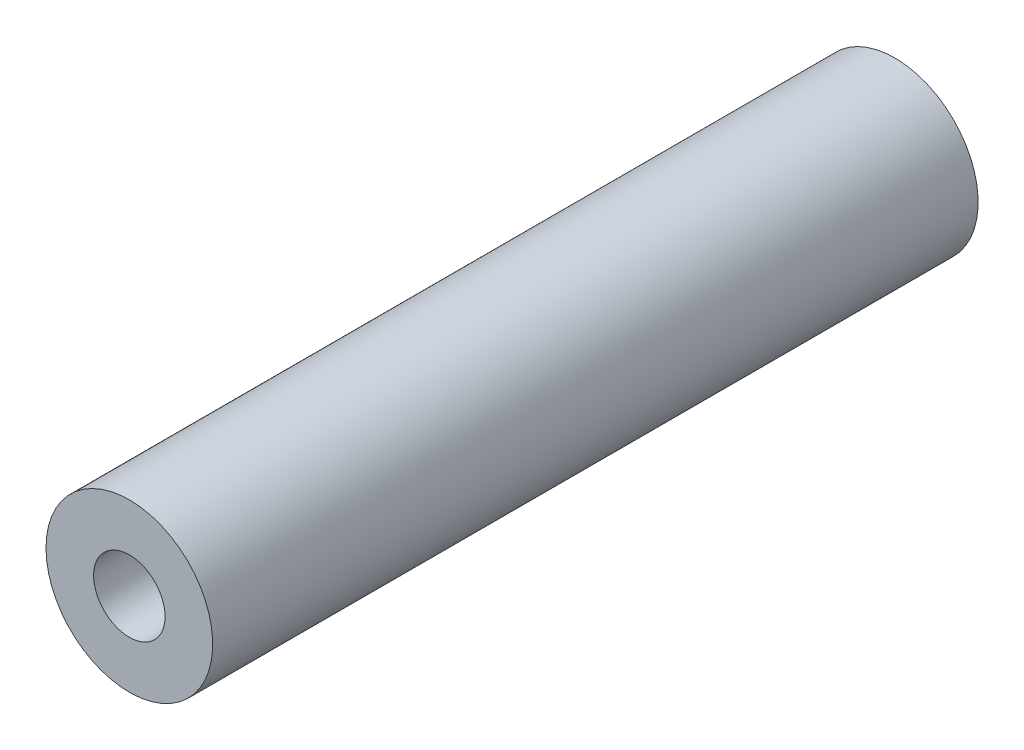
ISO-10303-21;
HEADER;
FILE_DESCRIPTION(('STEP AP214'),'2;1');
FILE_NAME('part.step','',(''),(''),'','','');
FILE_SCHEMA(('AUTOMOTIVE_DESIGN { 1 0 10303 214 1 1 1 1 }'));
ENDSEC;
DATA;
#1=APPLICATION_CONTEXT('core data for automotive mechanical design processes');
#2=APPLICATION_PROTOCOL_DEFINITION('international standard','automotive_design',2000,#1);
#3=PRODUCT_CONTEXT('',#1,'mechanical');
#4=PRODUCT('Part','Part','',(#3));
#5=PRODUCT_RELATED_PRODUCT_CATEGORY('part','',(#4));
#6=PRODUCT_DEFINITION_FORMATION('','',#4);
#7=PRODUCT_DEFINITION_CONTEXT('part definition',#1,'design');
#8=PRODUCT_DEFINITION('design','',#6,#7);
#9=PRODUCT_DEFINITION_SHAPE('','',#8);
#10=(LENGTH_UNIT() NAMED_UNIT(*) SI_UNIT(.MILLI.,.METRE.));
#11=(NAMED_UNIT(*) PLANE_ANGLE_UNIT() SI_UNIT($,.RADIAN.));
#12=(NAMED_UNIT(*) SI_UNIT($,.STERADIAN.) SOLID_ANGLE_UNIT());
#13=UNCERTAINTY_MEASURE_WITH_UNIT(LENGTH_MEASURE(1.E-05),#10,'distance_accuracy_value','');
#14=(GEOMETRIC_REPRESENTATION_CONTEXT(3) GLOBAL_UNCERTAINTY_ASSIGNED_CONTEXT((#13)) GLOBAL_UNIT_ASSIGNED_CONTEXT((#10,
#11,#12)) REPRESENTATION_CONTEXT('',''));
#15=CARTESIAN_POINT('',(0.,0.,0.));
#16=DIRECTION('',(0.,0.,1.));
#17=DIRECTION('',(1.,0.,0.));
#18=AXIS2_PLACEMENT_3D('',#15,#16,#17);
#19=CARTESIAN_POINT('',(0.,0.,45.));
#20=DIRECTION('',(0.,0.,-1.));
#21=DIRECTION('',(-1.,0.,0.));
#22=AXIS2_PLACEMENT_3D('',#19,#20,#21);
#23=CYLINDRICAL_SURFACE('',#22,4.9);
#24=CARTESIAN_POINT('',(0.,0.,45.));
#25=DIRECTION('',(0.,0.,1.));
#26=DIRECTION('',(1.,0.,0.));
#27=AXIS2_PLACEMENT_3D('',#24,#25,#26);
#28=CIRCLE('',#27,4.9);
#29=CARTESIAN_POINT('',(-4.9,0.,45.));
#30=VERTEX_POINT('',#29);
#31=EDGE_CURVE('E11',#30,#30,#28,.T.);
#32=CARTESIAN_POINT('',(0.,0.,0.));
#33=DIRECTION('',(0.,0.,1.));
#34=DIRECTION('',(1.,0.,0.));
#35=AXIS2_PLACEMENT_3D('',#32,#33,#34);
#36=CIRCLE('',#35,4.9);
#37=CARTESIAN_POINT('',(-4.9,0.,0.));
#38=VERTEX_POINT('',#37);
#39=EDGE_CURVE('E48',#38,#38,#36,.T.);
#40=CARTESIAN_POINT('',(-4.9,0.,45.));
#41=CARTESIAN_POINT('',(-4.9,0.,44.53125));
#42=CARTESIAN_POINT('',(-4.9,0.,44.0625));
#43=CARTESIAN_POINT('',(-4.9,0.,43.125));
#44=CARTESIAN_POINT('',(-4.9,0.,42.65625));
#45=CARTESIAN_POINT('',(-4.9,0.,41.71875));
#46=CARTESIAN_POINT('',(-4.9,0.,41.25));
#47=CARTESIAN_POINT('',(-4.9,0.,40.3125));
#48=CARTESIAN_POINT('',(-4.9,0.,39.84375));
#49=CARTESIAN_POINT('',(-4.9,0.,38.90625));
#50=CARTESIAN_POINT('',(-4.9,0.,38.4375));
#51=CARTESIAN_POINT('',(-4.9,0.,37.5));
#52=CARTESIAN_POINT('',(-4.9,0.,37.03125));
#53=CARTESIAN_POINT('',(-4.9,0.,36.09375));
#54=CARTESIAN_POINT('',(-4.9,0.,35.625));
#55=CARTESIAN_POINT('',(-4.9,0.,34.6875));
#56=CARTESIAN_POINT('',(-4.9,0.,34.21875));
#57=CARTESIAN_POINT('',(-4.9,0.,33.28125));
#58=CARTESIAN_POINT('',(-4.9,0.,32.8125));
#59=CARTESIAN_POINT('',(-4.9,0.,31.875));
#60=CARTESIAN_POINT('',(-4.9,0.,31.40625));
#61=CARTESIAN_POINT('',(-4.9,0.,30.46875));
#62=CARTESIAN_POINT('',(-4.9,0.,30.));
#63=CARTESIAN_POINT('',(-4.9,0.,29.0625));
#64=CARTESIAN_POINT('',(-4.9,0.,28.59375));
#65=CARTESIAN_POINT('',(-4.9,0.,27.65625));
#66=CARTESIAN_POINT('',(-4.9,0.,27.1875));
#67=CARTESIAN_POINT('',(-4.9,0.,26.25));
#68=CARTESIAN_POINT('',(-4.9,0.,25.78125));
#69=CARTESIAN_POINT('',(-4.9,0.,24.84375));
#70=CARTESIAN_POINT('',(-4.9,0.,24.375));
#71=CARTESIAN_POINT('',(-4.9,0.,23.4375));
#72=CARTESIAN_POINT('',(-4.9,0.,22.96875));
#73=CARTESIAN_POINT('',(-4.9,0.,22.03125));
#74=CARTESIAN_POINT('',(-4.9,0.,21.5625));
#75=CARTESIAN_POINT('',(-4.9,0.,20.625));
#76=CARTESIAN_POINT('',(-4.9,0.,20.15625));
#77=CARTESIAN_POINT('',(-4.9,0.,19.21875));
#78=CARTESIAN_POINT('',(-4.9,0.,18.75));
#79=CARTESIAN_POINT('',(-4.9,0.,17.8125));
#80=CARTESIAN_POINT('',(-4.9,0.,17.34375));
#81=CARTESIAN_POINT('',(-4.9,0.,16.40625));
#82=CARTESIAN_POINT('',(-4.9,0.,15.9375));
#83=CARTESIAN_POINT('',(-4.9,0.,15.));
#84=CARTESIAN_POINT('',(-4.9,0.,14.53125));
#85=CARTESIAN_POINT('',(-4.9,0.,13.59375));
#86=CARTESIAN_POINT('',(-4.9,0.,13.125));
#87=CARTESIAN_POINT('',(-4.9,0.,12.1875));
#88=CARTESIAN_POINT('',(-4.9,0.,11.71875));
#89=CARTESIAN_POINT('',(-4.9,0.,10.78125));
#90=CARTESIAN_POINT('',(-4.9,0.,10.3125));
#91=CARTESIAN_POINT('',(-4.9,0.,9.37499999999999));
#92=CARTESIAN_POINT('',(-4.9,0.,8.90624999999999));
#93=CARTESIAN_POINT('',(-4.9,0.,7.96874999999999));
#94=CARTESIAN_POINT('',(-4.9,0.,7.5));
#95=CARTESIAN_POINT('',(-4.9,0.,6.56249999999999));
#96=CARTESIAN_POINT('',(-4.9,0.,6.09374999999999));
#97=CARTESIAN_POINT('',(-4.9,0.,5.15624999999999));
#98=CARTESIAN_POINT('',(-4.9,0.,4.68749999999999));
#99=CARTESIAN_POINT('',(-4.9,0.,3.74999999999999));
#100=CARTESIAN_POINT('',(-4.9,0.,3.28124999999999));
#101=CARTESIAN_POINT('',(-4.9,0.,2.34374999999999));
#102=CARTESIAN_POINT('',(-4.9,0.,1.87499999999999));
#103=CARTESIAN_POINT('',(-4.9,0.,0.937499999999992));
#104=CARTESIAN_POINT('',(-4.9,0.,0.468749999999993));
#105=CARTESIAN_POINT('',(-4.9,0.,0.));
#106=B_SPLINE_CURVE_WITH_KNOTS('',3,(#40,#41,#42,#43,#44,#45,#46,#47,#48,#49,#50,#51,#52,#53,
#54,#55,#56,#57,#58,#59,#60,#61,#62,#63,#64,#65,#66,#67,#68,#69,#70,#71,#72,#73,#74,#75,#76,#77,
#78,#79,#80,#81,#82,#83,#84,#85,#86,#87,#88,#89,#90,#91,#92,#93,#94,#95,#96,#97,#98,#99,#100,
#101,#102,#103,#104,#105),.UNSPECIFIED.,.F.,.F.,(4,2,2,2,2,2,2,2,2,2,2,2,2,2,2,2,2,2,2,2,2,2,2,
2,2,2,2,2,2,2,2,2,4),(0.,1.40625,2.8125,4.21874999999999,5.625,7.03125,8.43749999999999,9.84375,
11.25,12.65625,14.0625,15.46875,16.875,18.28125,19.6875,21.09375,22.5,23.90625,25.3125,26.71875,
28.125,29.53125,30.9375,32.34375,33.75,35.15625,36.5625,37.96875,39.375,40.78125,42.1875,
43.59375,45.),.UNSPECIFIED.);
#107=EDGE_CURVE('BSEAM45',#30,#38,#106,.T.);
#108=ORIENTED_EDGE('',*,*,#31,.F.);
#109=ORIENTED_EDGE('',*,*,#39,.T.);
#110=ORIENTED_EDGE('',*,*,#107,.T.);
#111=ORIENTED_EDGE('',*,*,#107,.F.);
#112=EDGE_LOOP('',(#108,#110,#109,#111));
#113=FACE_BOUND('',#112,.T.);
#114=ADVANCED_FACE('F45',(#113),#23,.T.);
#115=CARTESIAN_POINT('',(0.,0.,45.));
#116=DIRECTION('',(0.,0.,1.));
#117=DIRECTION('',(1.,0.,0.));
#118=AXIS2_PLACEMENT_3D('',#115,#116,#117);
#119=PLANE('',#118);
#120=CARTESIAN_POINT('',(0.,0.,45.));
#121=DIRECTION('',(0.,0.,1.));
#122=DIRECTION('',(1.,0.,0.));
#123=AXIS2_PLACEMENT_3D('',#120,#121,#122);
#124=CIRCLE('',#123,2.09999999999999);
#125=CARTESIAN_POINT('',(2.09999999999999,0.,45.));
#126=VERTEX_POINT('',#125);
#127=EDGE_CURVE('E99',#126,#126,#124,.T.);
#128=ORIENTED_EDGE('',*,*,#127,.F.);
#129=EDGE_LOOP('',(#128));
#130=FACE_BOUND('',#129,.T.);
#131=ORIENTED_EDGE('',*,*,#31,.T.);
#132=EDGE_LOOP('',(#131));
#133=FACE_BOUND('',#132,.T.);
#134=ADVANCED_FACE('F116',(#130,#133),#119,.T.);
#135=CARTESIAN_POINT('',(0.,0.,0.));
#136=DIRECTION('',(0.,0.,1.));
#137=DIRECTION('',(1.,0.,0.));
#138=AXIS2_PLACEMENT_3D('',#135,#136,#137);
#139=PLANE('',#138);
#140=CARTESIAN_POINT('',(2.59807621135333,-1.49999999999998,0.));
#141=DIRECTION('',(0.,0.,-1.));
#142=DIRECTION('',(-1.,0.,0.));
#143=AXIS2_PLACEMENT_3D('',#140,#141,#142);
#144=CIRCLE('',#143,0.79999999999999);
#145=CARTESIAN_POINT('',(1.79807621135334,-1.49999999999998,0.));
#146=VERTEX_POINT('',#145);
#147=EDGE_CURVE('E78',#146,#146,#144,.T.);
#148=ORIENTED_EDGE('',*,*,#147,.F.);
#149=EDGE_LOOP('',(#148));
#150=FACE_BOUND('',#149,.T.);
#151=CARTESIAN_POINT('',(-2.59807621135331,-1.50000000000001,0.));
#152=DIRECTION('',(0.,0.,-1.));
#153=DIRECTION('',(-1.,0.,0.));
#154=AXIS2_PLACEMENT_3D('',#151,#152,#153);
#155=CIRCLE('',#154,0.79999999999999);
#156=CARTESIAN_POINT('',(-3.3980762113533,-1.50000000000001,0.));
#157=VERTEX_POINT('',#156);
#158=EDGE_CURVE('E77',#157,#157,#155,.T.);
#159=ORIENTED_EDGE('',*,*,#158,.F.);
#160=EDGE_LOOP('',(#159));
#161=FACE_BOUND('',#160,.T.);
#162=CARTESIAN_POINT('',(0.,3.,0.));
#163=DIRECTION('',(0.,0.,-1.));
#164=DIRECTION('',(-1.,0.,0.));
#165=AXIS2_PLACEMENT_3D('',#162,#163,#164);
#166=CIRCLE('',#165,0.79999999999999);
#167=CARTESIAN_POINT('',(-0.79999999999999,3.,0.));
#168=VERTEX_POINT('',#167);
#169=EDGE_CURVE('E91',#168,#168,#166,.T.);
#170=ORIENTED_EDGE('',*,*,#169,.F.);
#171=EDGE_LOOP('',(#170));
#172=FACE_BOUND('',#171,.T.);
#173=ORIENTED_EDGE('',*,*,#39,.F.);
#174=EDGE_LOOP('',(#173));
#175=FACE_BOUND('',#174,.T.);
#176=ADVANCED_FACE('F113',(#150,#161,#172,#175),#139,.F.);
#177=CARTESIAN_POINT('',(0.,0.,31.));
#178=DIRECTION('',(0.,0.,1.));
#179=DIRECTION('',(1.,0.,0.));
#180=AXIS2_PLACEMENT_3D('',#177,#178,#179);
#181=CONICAL_SURFACE('',#180,2.09999999999999,1.02974425867665);
#182=CARTESIAN_POINT('',(0.,0.,29.7381927000421));
#183=VERTEX_POINT('',#182);
#184=VERTEX_LOOP('',#183);
#185=FACE_BOUND('',#184,.T.);
#186=CARTESIAN_POINT('',(0.,0.,31.));
#187=DIRECTION('',(0.,0.,1.));
#188=DIRECTION('',(1.,0.,0.));
#189=AXIS2_PLACEMENT_3D('',#186,#187,#188);
#190=CIRCLE('',#189,2.09999999999999);
#191=CARTESIAN_POINT('',(2.09999999999999,0.,31.));
#192=VERTEX_POINT('',#191);
#193=EDGE_CURVE('E103',#192,#192,#190,.T.);
#194=ORIENTED_EDGE('',*,*,#193,.T.);
#195=EDGE_LOOP('',(#194));
#196=FACE_BOUND('',#195,.T.);
#197=ADVANCED_FACE('F115',(#185,#196),#181,.F.);
#198=CARTESIAN_POINT('',(0.,0.,45.));
#199=DIRECTION('',(0.,0.,1.));
#200=DIRECTION('',(1.,0.,0.));
#201=AXIS2_PLACEMENT_3D('',#198,#199,#200);
#202=CYLINDRICAL_SURFACE('',#201,2.09999999999999);
#203=ORIENTED_EDGE('',*,*,#193,.F.);
#204=EDGE_LOOP('',(#203));
#205=FACE_BOUND('',#204,.T.);
#206=ORIENTED_EDGE('',*,*,#127,.T.);
#207=EDGE_LOOP('',(#206));
#208=FACE_BOUND('',#207,.T.);
#209=ADVANCED_FACE('F122',(#205,#208),#202,.F.);
#210=CARTESIAN_POINT('',(0.,3.,8.));
#211=DIRECTION('',(0.,0.,-1.));
#212=DIRECTION('',(-1.,0.,0.));
#213=AXIS2_PLACEMENT_3D('',#210,#211,#212);
#214=CONICAL_SURFACE('',#213,0.799999999999998,1.02974425867665);
#215=CARTESIAN_POINT('',(0.,3.,8.48068849522205));
#216=VERTEX_POINT('',#215);
#217=VERTEX_LOOP('',#216);
#218=FACE_BOUND('',#217,.T.);
#219=CARTESIAN_POINT('',(0.,3.,8.));
#220=DIRECTION('',(0.,0.,-1.));
#221=DIRECTION('',(-1.,0.,0.));
#222=AXIS2_PLACEMENT_3D('',#219,#220,#221);
#223=CIRCLE('',#222,0.799999999999998);
#224=CARTESIAN_POINT('',(-0.799999999999998,3.,8.));
#225=VERTEX_POINT('',#224);
#226=EDGE_CURVE('E95',#225,#225,#223,.T.);
#227=ORIENTED_EDGE('',*,*,#226,.T.);
#228=EDGE_LOOP('',(#227));
#229=FACE_BOUND('',#228,.T.);
#230=ADVANCED_FACE('F150',(#218,#229),#214,.F.);
#231=CARTESIAN_POINT('',(0.,3.,0.));
#232=DIRECTION('',(0.,0.,-1.));
#233=DIRECTION('',(-1.,0.,0.));
#234=AXIS2_PLACEMENT_3D('',#231,#232,#233);
#235=CYLINDRICAL_SURFACE('',#234,0.799999999999994);
#236=ORIENTED_EDGE('',*,*,#226,.F.);
#237=EDGE_LOOP('',(#236));
#238=FACE_BOUND('',#237,.T.);
#239=ORIENTED_EDGE('',*,*,#169,.T.);
#240=EDGE_LOOP('',(#239));
#241=FACE_BOUND('',#240,.T.);
#242=ADVANCED_FACE('F155',(#238,#241),#235,.F.);
#243=CARTESIAN_POINT('',(-2.59807621135331,-1.50000000000001,8.));
#244=DIRECTION('',(0.,0.,-1.));
#245=DIRECTION('',(-1.,0.,0.));
#246=AXIS2_PLACEMENT_3D('',#243,#244,#245);
#247=CONICAL_SURFACE('',#246,0.799999999999998,1.02974425867665);
#248=CARTESIAN_POINT('',(-2.59807621135331,-1.50000000000001,8.48068849522205));
#249=VERTEX_POINT('',#248);
#250=VERTEX_LOOP('',#249);
#251=FACE_BOUND('',#250,.T.);
#252=CARTESIAN_POINT('',(-2.59807621135331,-1.50000000000001,8.));
#253=DIRECTION('',(0.,0.,-1.));
#254=DIRECTION('',(-1.,0.,0.));
#255=AXIS2_PLACEMENT_3D('',#252,#253,#254);
#256=CIRCLE('',#255,0.799999999999998);
#257=CARTESIAN_POINT('',(-3.39807621135331,-1.50000000000001,8.));
#258=VERTEX_POINT('',#257);
#259=EDGE_CURVE('E83',#258,#258,#256,.T.);
#260=ORIENTED_EDGE('',*,*,#259,.T.);
#261=EDGE_LOOP('',(#260));
#262=FACE_BOUND('',#261,.T.);
#263=ADVANCED_FACE('F161',(#251,#262),#247,.F.);
#264=CARTESIAN_POINT('',(-2.59807621135331,-1.50000000000001,0.));
#265=DIRECTION('',(0.,0.,-1.));
#266=DIRECTION('',(-1.,0.,0.));
#267=AXIS2_PLACEMENT_3D('',#264,#265,#266);
#268=CYLINDRICAL_SURFACE('',#267,0.799999999999994);
#269=ORIENTED_EDGE('',*,*,#259,.F.);
#270=EDGE_LOOP('',(#269));
#271=FACE_BOUND('',#270,.T.);
#272=ORIENTED_EDGE('',*,*,#158,.T.);
#273=EDGE_LOOP('',(#272));
#274=FACE_BOUND('',#273,.T.);
#275=ADVANCED_FACE('F70',(#271,#274),#268,.F.);
#276=CARTESIAN_POINT('',(2.59807621135333,-1.49999999999998,8.));
#277=DIRECTION('',(0.,0.,-1.));
#278=DIRECTION('',(-1.,0.,0.));
#279=AXIS2_PLACEMENT_3D('',#276,#277,#278);
#280=CONICAL_SURFACE('',#279,0.799999999999998,1.02974425867665);
#281=CARTESIAN_POINT('',(2.59807621135333,-1.49999999999998,8.48068849522205));
#282=VERTEX_POINT('',#281);
#283=VERTEX_LOOP('',#282);
#284=FACE_BOUND('',#283,.T.);
#285=CARTESIAN_POINT('',(2.59807621135333,-1.49999999999998,8.));
#286=DIRECTION('',(0.,0.,-1.));
#287=DIRECTION('',(-1.,0.,0.));
#288=AXIS2_PLACEMENT_3D('',#285,#286,#287);
#289=CIRCLE('',#288,0.799999999999998);
#290=CARTESIAN_POINT('',(1.79807621135333,-1.49999999999998,8.));
#291=VERTEX_POINT('',#290);
#292=EDGE_CURVE('E74',#291,#291,#289,.T.);
#293=ORIENTED_EDGE('',*,*,#292,.T.);
#294=EDGE_LOOP('',(#293));
#295=FACE_BOUND('',#294,.T.);
#296=ADVANCED_FACE('F66',(#284,#295),#280,.F.);
#297=CARTESIAN_POINT('',(2.59807621135333,-1.49999999999998,0.));
#298=DIRECTION('',(0.,0.,-1.));
#299=DIRECTION('',(-1.,0.,0.));
#300=AXIS2_PLACEMENT_3D('',#297,#298,#299);
#301=CYLINDRICAL_SURFACE('',#300,0.799999999999994);
#302=ORIENTED_EDGE('',*,*,#292,.F.);
#303=EDGE_LOOP('',(#302));
#304=FACE_BOUND('',#303,.T.);
#305=ORIENTED_EDGE('',*,*,#147,.T.);
#306=EDGE_LOOP('',(#305));
#307=FACE_BOUND('',#306,.T.);
#308=ADVANCED_FACE('F69',(#304,#307),#301,.F.);
#309=CLOSED_SHELL('',(#114,#134,#176,#197,#209,#230,#242,#263,#275,#296,#308));
#310=MANIFOLD_SOLID_BREP('B2',#309);
#311=ADVANCED_BREP_SHAPE_REPRESENTATION('',(#18,#310),#14);
#312=SHAPE_DEFINITION_REPRESENTATION(#9,#311);
ENDSEC;
END-ISO-10303-21;
